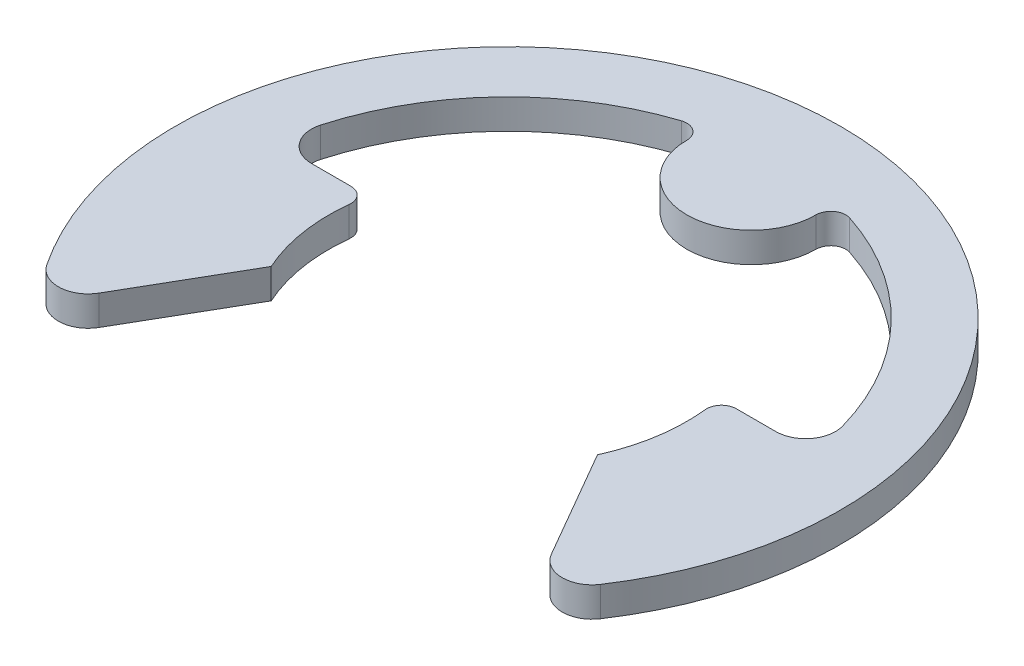
ISO-10303-21;
HEADER;
FILE_DESCRIPTION(('STEP AP214'),'2;1');
FILE_NAME('part.step','',(''),(''),'','','');
FILE_SCHEMA(('AUTOMOTIVE_DESIGN { 1 0 10303 214 1 1 1 1 }'));
ENDSEC;
DATA;
#1=APPLICATION_CONTEXT('core data for automotive mechanical design processes');
#2=APPLICATION_PROTOCOL_DEFINITION('international standard','automotive_design',2000,#1);
#3=PRODUCT_CONTEXT('',#1,'mechanical');
#4=PRODUCT('Part','Part','',(#3));
#5=PRODUCT_RELATED_PRODUCT_CATEGORY('part','',(#4));
#6=PRODUCT_DEFINITION_FORMATION('','',#4);
#7=PRODUCT_DEFINITION_CONTEXT('part definition',#1,'design');
#8=PRODUCT_DEFINITION('design','',#6,#7);
#9=PRODUCT_DEFINITION_SHAPE('','',#8);
#10=(LENGTH_UNIT() NAMED_UNIT(*) SI_UNIT(.MILLI.,.METRE.));
#11=(NAMED_UNIT(*) PLANE_ANGLE_UNIT() SI_UNIT($,.RADIAN.));
#12=(NAMED_UNIT(*) SI_UNIT($,.STERADIAN.) SOLID_ANGLE_UNIT());
#13=UNCERTAINTY_MEASURE_WITH_UNIT(LENGTH_MEASURE(1.E-05),#10,'distance_accuracy_value','');
#14=(GEOMETRIC_REPRESENTATION_CONTEXT(3) GLOBAL_UNCERTAINTY_ASSIGNED_CONTEXT((#13)) GLOBAL_UNIT_ASSIGNED_CONTEXT((#10,
#11,#12)) REPRESENTATION_CONTEXT('',''));
#15=CARTESIAN_POINT('',(0.,0.,0.));
#16=DIRECTION('',(0.,0.,1.));
#17=DIRECTION('',(1.,0.,0.));
#18=AXIS2_PLACEMENT_3D('',#15,#16,#17);
#19=CARTESIAN_POINT('',(0.,2.,0.));
#20=DIRECTION('',(0.,-1.,0.));
#21=DIRECTION('',(0.,0.,-1.));
#22=AXIS2_PLACEMENT_3D('',#19,#20,#21);
#23=CYLINDRICAL_SURFACE('',#22,12.);
#24=CARTESIAN_POINT('',(0.,0.,0.));
#25=DIRECTION('',(0.,-1.,0.));
#26=DIRECTION('',(0.,0.,1.));
#27=AXIS2_PLACEMENT_3D('',#24,#25,#26);
#28=CIRCLE('',#27,12.);
#29=CARTESIAN_POINT('',(11.9302112650364,0.,-1.29230769230769));
#30=VERTEX_POINT('',#29);
#31=CARTESIAN_POINT('',(10.94,0.,4.9311661906693));
#32=VERTEX_POINT('',#31);
#33=EDGE_CURVE('E200',#30,#32,#28,.T.);
#34=ORIENTED_EDGE('',*,*,#33,.T.);
#35=DIRECTION('',(0.,-1.,0.));
#36=VECTOR('',#35,1.);
#37=CARTESIAN_POINT('',(10.94,2.,4.9311661906693));
#38=LINE('',#37,#36);
#39=CARTESIAN_POINT('',(10.94,2.,4.9311661906693));
#40=VERTEX_POINT('',#39);
#41=EDGE_CURVE('E11',#40,#32,#38,.T.);
#42=ORIENTED_EDGE('',*,*,#41,.F.);
#43=CARTESIAN_POINT('',(0.,2.,0.));
#44=DIRECTION('',(0.,-1.,0.));
#45=DIRECTION('',(0.,0.,1.));
#46=AXIS2_PLACEMENT_3D('',#43,#44,#45);
#47=CIRCLE('',#46,12.);
#48=CARTESIAN_POINT('',(11.9302112650364,2.,-1.29230769230769));
#49=VERTEX_POINT('',#48);
#50=EDGE_CURVE('E252',#49,#40,#47,.T.);
#51=ORIENTED_EDGE('',*,*,#50,.F.);
#52=DIRECTION('',(0.,-1.,0.));
#53=VECTOR('',#52,1.);
#54=CARTESIAN_POINT('',(11.9302112650364,2.,-1.29230769230769));
#55=LINE('',#54,#53);
#56=EDGE_CURVE('E196',#49,#30,#55,.T.);
#57=ORIENTED_EDGE('',*,*,#56,.T.);
#58=EDGE_LOOP('',(#34,#42,#51,#57));
#59=FACE_BOUND('',#58,.T.);
#60=ADVANCED_FACE('F39',(#59),#23,.F.);
#61=CARTESIAN_POINT('',(15.1655202284553,2.,12.249981914764));
#62=DIRECTION('',(0.866025403784439,0.,-0.499999999999999));
#63=DIRECTION('',(-0.499999999999999,0.,-0.866025403784439));
#64=AXIS2_PLACEMENT_3D('',#61,#62,#63);
#65=PLANE('',#64);
#66=DIRECTION('',(0.499999999999999,0.,0.866025403784439));
#67=VECTOR('',#66,1.);
#68=CARTESIAN_POINT('',(15.1655202284553,0.,12.249981914764));
#69=LINE('',#68,#67);
#70=CARTESIAN_POINT('',(15.1655202284553,0.,12.249981914764));
#71=VERTEX_POINT('',#70);
#72=EDGE_CURVE('E204',#32,#71,#69,.T.);
#73=ORIENTED_EDGE('',*,*,#72,.T.);
#74=DIRECTION('',(0.,-1.,0.));
#75=VECTOR('',#74,1.);
#76=CARTESIAN_POINT('',(15.1655202284553,2.,12.249981914764));
#77=LINE('',#76,#75);
#78=CARTESIAN_POINT('',(15.1655202284553,2.,12.249981914764));
#79=VERTEX_POINT('',#78);
#80=EDGE_CURVE('E48',#79,#71,#77,.T.);
#81=ORIENTED_EDGE('',*,*,#80,.F.);
#82=DIRECTION('',(0.499999999999999,0.,0.866025403784439));
#83=VECTOR('',#82,1.);
#84=CARTESIAN_POINT('',(15.1655202284553,2.,12.249981914764));
#85=LINE('',#84,#83);
#86=EDGE_CURVE('E129',#40,#79,#85,.T.);
#87=ORIENTED_EDGE('',*,*,#86,.F.);
#88=ORIENTED_EDGE('',*,*,#41,.T.);
#89=EDGE_LOOP('',(#73,#81,#87,#88));
#90=FACE_BOUND('',#89,.T.);
#91=ADVANCED_FACE('F388',(#90),#65,.F.);
#92=CARTESIAN_POINT('',(16.8975710360242,2.,11.249981914764));
#93=DIRECTION('',(0.,-1.,0.));
#94=DIRECTION('',(0.,0.,-1.));
#95=AXIS2_PLACEMENT_3D('',#92,#93,#94);
#96=CYLINDRICAL_SURFACE('',#95,2.);
#97=CARTESIAN_POINT('',(16.8975710360242,0.,11.249981914764));
#98=DIRECTION('',(0.,1.,0.));
#99=DIRECTION('',(0.,0.,-1.));
#100=AXIS2_PLACEMENT_3D('',#97,#98,#99);
#101=CIRCLE('',#100,2.);
#102=CARTESIAN_POINT('',(18.5623563597704,0.,12.3583545172038));
#103=VERTEX_POINT('',#102);
#104=EDGE_CURVE('E207',#71,#103,#101,.T.);
#105=ORIENTED_EDGE('',*,*,#104,.T.);
#106=DIRECTION('',(0.,-1.,0.));
#107=VECTOR('',#106,1.);
#108=CARTESIAN_POINT('',(18.5623563597704,2.,12.3583545172038));
#109=LINE('',#108,#107);
#110=CARTESIAN_POINT('',(18.5623563597704,2.,12.3583545172038));
#111=VERTEX_POINT('',#110);
#112=EDGE_CURVE('E303',#111,#103,#109,.T.);
#113=ORIENTED_EDGE('',*,*,#112,.F.);
#114=CARTESIAN_POINT('',(16.8975710360242,2.,11.249981914764));
#115=DIRECTION('',(0.,1.,0.));
#116=DIRECTION('',(0.,0.,-1.));
#117=AXIS2_PLACEMENT_3D('',#114,#115,#116);
#118=CIRCLE('',#117,2.);
#119=EDGE_CURVE('E313',#79,#111,#118,.T.);
#120=ORIENTED_EDGE('',*,*,#119,.F.);
#121=ORIENTED_EDGE('',*,*,#80,.T.);
#122=EDGE_LOOP('',(#105,#113,#120,#121));
#123=FACE_BOUND('',#122,.T.);
#124=ADVANCED_FACE('F311',(#123),#96,.T.);
#125=CARTESIAN_POINT('',(0.,2.,0.));
#126=DIRECTION('',(0.,-1.,0.));
#127=DIRECTION('',(0.,0.,-1.));
#128=AXIS2_PLACEMENT_3D('',#125,#126,#127);
#129=CYLINDRICAL_SURFACE('',#128,22.3);
#130=CARTESIAN_POINT('',(0.,0.,0.));
#131=DIRECTION('',(0.,1.,0.));
#132=DIRECTION('',(0.,0.,-1.));
#133=AXIS2_PLACEMENT_3D('',#130,#131,#132);
#134=CIRCLE('',#133,22.3);
#135=CARTESIAN_POINT('',(-18.5623563597704,0.,12.3583545172038));
#136=VERTEX_POINT('',#135);
#137=EDGE_CURVE('E210',#103,#136,#134,.T.);
#138=ORIENTED_EDGE('',*,*,#137,.T.);
#139=DIRECTION('',(0.,-1.,0.));
#140=VECTOR('',#139,1.);
#141=CARTESIAN_POINT('',(-18.5623563597704,2.,12.3583545172038));
#142=LINE('',#141,#140);
#143=CARTESIAN_POINT('',(-18.5623563597704,2.,12.3583545172038));
#144=VERTEX_POINT('',#143);
#145=EDGE_CURVE('E299',#144,#136,#142,.T.);
#146=ORIENTED_EDGE('',*,*,#145,.F.);
#147=CARTESIAN_POINT('',(0.,2.,0.));
#148=DIRECTION('',(0.,1.,0.));
#149=DIRECTION('',(0.,0.,-1.));
#150=AXIS2_PLACEMENT_3D('',#147,#148,#149);
#151=CIRCLE('',#150,22.3);
#152=EDGE_CURVE('E332',#111,#144,#151,.T.);
#153=ORIENTED_EDGE('',*,*,#152,.F.);
#154=ORIENTED_EDGE('',*,*,#112,.T.);
#155=EDGE_LOOP('',(#138,#146,#153,#154));
#156=FACE_BOUND('',#155,.T.);
#157=ADVANCED_FACE('F322',(#156),#129,.T.);
#158=CARTESIAN_POINT('',(-16.8975710360242,2.,11.249981914764));
#159=DIRECTION('',(0.,-1.,0.));
#160=DIRECTION('',(0.,0.,-1.));
#161=AXIS2_PLACEMENT_3D('',#158,#159,#160);
#162=CYLINDRICAL_SURFACE('',#161,2.);
#163=CARTESIAN_POINT('',(-16.8975710360242,0.,11.249981914764));
#164=DIRECTION('',(0.,1.,0.));
#165=DIRECTION('',(0.,0.,-1.));
#166=AXIS2_PLACEMENT_3D('',#163,#164,#165);
#167=CIRCLE('',#166,2.);
#168=CARTESIAN_POINT('',(-15.1655202284553,0.,12.249981914764));
#169=VERTEX_POINT('',#168);
#170=EDGE_CURVE('E213',#136,#169,#167,.T.);
#171=ORIENTED_EDGE('',*,*,#170,.T.);
#172=DIRECTION('',(0.,-1.,0.));
#173=VECTOR('',#172,1.);
#174=CARTESIAN_POINT('',(-15.1655202284553,2.,12.249981914764));
#175=LINE('',#174,#173);
#176=CARTESIAN_POINT('',(-15.1655202284553,2.,12.249981914764));
#177=VERTEX_POINT('',#176);
#178=EDGE_CURVE('E295',#177,#169,#175,.T.);
#179=ORIENTED_EDGE('',*,*,#178,.F.);
#180=CARTESIAN_POINT('',(-16.8975710360242,2.,11.249981914764));
#181=DIRECTION('',(0.,1.,0.));
#182=DIRECTION('',(0.,0.,-1.));
#183=AXIS2_PLACEMENT_3D('',#180,#181,#182);
#184=CIRCLE('',#183,2.);
#185=EDGE_CURVE('E328',#144,#177,#184,.T.);
#186=ORIENTED_EDGE('',*,*,#185,.F.);
#187=ORIENTED_EDGE('',*,*,#145,.T.);
#188=EDGE_LOOP('',(#171,#179,#186,#187));
#189=FACE_BOUND('',#188,.T.);
#190=ADVANCED_FACE('F326',(#189),#162,.T.);
#191=CARTESIAN_POINT('',(-10.94,2.,4.9311661906693));
#192=DIRECTION('',(-0.86602540378444,0.,-0.499999999999997));
#193=DIRECTION('',(-0.499999999999997,0.,0.86602540378444));
#194=AXIS2_PLACEMENT_3D('',#191,#192,#193);
#195=PLANE('',#194);
#196=DIRECTION('',(0.499999999999997,0.,-0.86602540378444));
#197=VECTOR('',#196,1.);
#198=CARTESIAN_POINT('',(-10.94,0.,4.9311661906693));
#199=LINE('',#198,#197);
#200=CARTESIAN_POINT('',(-10.94,0.,4.9311661906693));
#201=VERTEX_POINT('',#200);
#202=EDGE_CURVE('E216',#169,#201,#199,.T.);
#203=ORIENTED_EDGE('',*,*,#202,.T.);
#204=DIRECTION('',(0.,-1.,0.));
#205=VECTOR('',#204,1.);
#206=CARTESIAN_POINT('',(-10.94,2.,4.9311661906693));
#207=LINE('',#206,#205);
#208=CARTESIAN_POINT('',(-10.94,2.,4.9311661906693));
#209=VERTEX_POINT('',#208);
#210=EDGE_CURVE('E291',#209,#201,#207,.T.);
#211=ORIENTED_EDGE('',*,*,#210,.F.);
#212=DIRECTION('',(0.499999999999997,0.,-0.86602540378444));
#213=VECTOR('',#212,1.);
#214=CARTESIAN_POINT('',(-10.94,2.,4.9311661906693));
#215=LINE('',#214,#213);
#216=EDGE_CURVE('E331',#177,#209,#215,.T.);
#217=ORIENTED_EDGE('',*,*,#216,.F.);
#218=ORIENTED_EDGE('',*,*,#178,.T.);
#219=EDGE_LOOP('',(#203,#211,#217,#218));
#220=FACE_BOUND('',#219,.T.);
#221=ADVANCED_FACE('F401',(#220),#195,.F.);
#222=CARTESIAN_POINT('',(0.,2.,0.));
#223=DIRECTION('',(0.,-1.,0.));
#224=DIRECTION('',(0.,0.,-1.));
#225=AXIS2_PLACEMENT_3D('',#222,#223,#224);
#226=CYLINDRICAL_SURFACE('',#225,12.);
#227=CARTESIAN_POINT('',(0.,0.,0.));
#228=DIRECTION('',(0.,-1.,0.));
#229=DIRECTION('',(0.,0.,1.));
#230=AXIS2_PLACEMENT_3D('',#227,#228,#229);
#231=CIRCLE('',#230,12.);
#232=CARTESIAN_POINT('',(-11.9302112650364,0.,-1.29230769230769));
#233=VERTEX_POINT('',#232);
#234=EDGE_CURVE('E219',#201,#233,#231,.T.);
#235=ORIENTED_EDGE('',*,*,#234,.T.);
#236=DIRECTION('',(0.,-1.,0.));
#237=VECTOR('',#236,1.);
#238=CARTESIAN_POINT('',(-11.9302112650364,2.,-1.29230769230769));
#239=LINE('',#238,#237);
#240=CARTESIAN_POINT('',(-11.9302112650364,2.,-1.29230769230769));
#241=VERTEX_POINT('',#240);
#242=EDGE_CURVE('E287',#241,#233,#239,.T.);
#243=ORIENTED_EDGE('',*,*,#242,.F.);
#244=CARTESIAN_POINT('',(0.,2.,0.));
#245=DIRECTION('',(0.,-1.,0.));
#246=DIRECTION('',(0.,0.,1.));
#247=AXIS2_PLACEMENT_3D('',#244,#245,#246);
#248=CIRCLE('',#247,12.);
#249=EDGE_CURVE('E336',#209,#241,#248,.T.);
#250=ORIENTED_EDGE('',*,*,#249,.F.);
#251=ORIENTED_EDGE('',*,*,#210,.T.);
#252=EDGE_LOOP('',(#235,#243,#250,#251));
#253=FACE_BOUND('',#252,.T.);
#254=ADVANCED_FACE('F404',(#253),#226,.F.);
#255=CARTESIAN_POINT('',(-12.9243955371228,2.,-1.4));
#256=DIRECTION('',(0.,-1.,0.));
#257=DIRECTION('',(0.,0.,-1.));
#258=AXIS2_PLACEMENT_3D('',#255,#256,#257);
#259=CYLINDRICAL_SURFACE('',#258,1.);
#260=CARTESIAN_POINT('',(-12.9243955371228,0.,-1.4));
#261=DIRECTION('',(0.,1.,0.));
#262=DIRECTION('',(0.,0.,-1.));
#263=AXIS2_PLACEMENT_3D('',#260,#261,#262);
#264=CIRCLE('',#263,1.);
#265=CARTESIAN_POINT('',(-12.9243955371228,0.,-2.4));
#266=VERTEX_POINT('',#265);
#267=EDGE_CURVE('E222',#233,#266,#264,.T.);
#268=ORIENTED_EDGE('',*,*,#267,.T.);
#269=DIRECTION('',(0.,-1.,0.));
#270=VECTOR('',#269,1.);
#271=CARTESIAN_POINT('',(-12.9243955371228,2.,-2.4));
#272=LINE('',#271,#270);
#273=CARTESIAN_POINT('',(-12.9243955371228,2.,-2.4));
#274=VERTEX_POINT('',#273);
#275=EDGE_CURVE('E283',#274,#266,#272,.T.);
#276=ORIENTED_EDGE('',*,*,#275,.F.);
#277=CARTESIAN_POINT('',(-12.9243955371228,2.,-1.4));
#278=DIRECTION('',(0.,1.,0.));
#279=DIRECTION('',(0.,0.,-1.));
#280=AXIS2_PLACEMENT_3D('',#277,#278,#279);
#281=CIRCLE('',#280,1.);
#282=EDGE_CURVE('E343',#241,#274,#281,.T.);
#283=ORIENTED_EDGE('',*,*,#282,.F.);
#284=ORIENTED_EDGE('',*,*,#242,.T.);
#285=EDGE_LOOP('',(#268,#276,#283,#284));
#286=FACE_BOUND('',#285,.T.);
#287=ADVANCED_FACE('F408',(#286),#259,.T.);
#288=CARTESIAN_POINT('',(-15.5702408459214,2.,-2.4));
#289=DIRECTION('',(0.,0.,1.));
#290=DIRECTION('',(1.,0.,0.));
#291=AXIS2_PLACEMENT_3D('',#288,#289,#290);
#292=PLANE('',#291);
#293=DIRECTION('',(-1.,0.,0.));
#294=VECTOR('',#293,1.);
#295=CARTESIAN_POINT('',(-15.5702408459214,0.,-2.4));
#296=LINE('',#295,#294);
#297=CARTESIAN_POINT('',(-15.5702408459214,0.,-2.4));
#298=VERTEX_POINT('',#297);
#299=EDGE_CURVE('E225',#266,#298,#296,.T.);
#300=ORIENTED_EDGE('',*,*,#299,.T.);
#301=DIRECTION('',(0.,-1.,0.));
#302=VECTOR('',#301,1.);
#303=CARTESIAN_POINT('',(-15.5702408459214,2.,-2.4));
#304=LINE('',#303,#302);
#305=CARTESIAN_POINT('',(-15.5702408459214,2.,-2.4));
#306=VERTEX_POINT('',#305);
#307=EDGE_CURVE('E279',#306,#298,#304,.T.);
#308=ORIENTED_EDGE('',*,*,#307,.F.);
#309=DIRECTION('',(-1.,0.,0.));
#310=VECTOR('',#309,1.);
#311=CARTESIAN_POINT('',(-15.5702408459214,2.,-2.4));
#312=LINE('',#311,#310);
#313=EDGE_CURVE('E346',#274,#306,#312,.T.);
#314=ORIENTED_EDGE('',*,*,#313,.F.);
#315=ORIENTED_EDGE('',*,*,#275,.T.);
#316=EDGE_LOOP('',(#300,#308,#314,#315));
#317=FACE_BOUND('',#316,.T.);
#318=ADVANCED_FACE('F412',(#317),#292,.F.);
#319=CARTESIAN_POINT('',(-15.5702408459214,2.,-4.4));
#320=DIRECTION('',(0.,-1.,0.));
#321=DIRECTION('',(0.,0.,-1.));
#322=AXIS2_PLACEMENT_3D('',#319,#320,#321);
#323=CYLINDRICAL_SURFACE('',#322,2.);
#324=CARTESIAN_POINT('',(-15.5702408459214,0.,-4.4));
#325=DIRECTION('',(0.,-1.,0.));
#326=DIRECTION('',(0.,0.,1.));
#327=AXIS2_PLACEMENT_3D('',#324,#325,#326);
#328=CIRCLE('',#327,2.);
#329=CARTESIAN_POINT('',(-17.4948688862084,0.,-4.94388133498146));
#330=VERTEX_POINT('',#329);
#331=EDGE_CURVE('E228',#298,#330,#328,.T.);
#332=ORIENTED_EDGE('',*,*,#331,.T.);
#333=DIRECTION('',(0.,-1.,0.));
#334=VECTOR('',#333,1.);
#335=CARTESIAN_POINT('',(-17.4948688862084,2.,-4.94388133498146));
#336=LINE('',#335,#334);
#337=CARTESIAN_POINT('',(-17.4948688862084,2.,-4.94388133498146));
#338=VERTEX_POINT('',#337);
#339=EDGE_CURVE('E275',#338,#330,#336,.T.);
#340=ORIENTED_EDGE('',*,*,#339,.F.);
#341=CARTESIAN_POINT('',(-15.5702408459214,2.,-4.4));
#342=DIRECTION('',(0.,-1.,0.));
#343=DIRECTION('',(0.,0.,1.));
#344=AXIS2_PLACEMENT_3D('',#341,#342,#343);
#345=CIRCLE('',#344,2.);
#346=EDGE_CURVE('E349',#306,#338,#345,.T.);
#347=ORIENTED_EDGE('',*,*,#346,.F.);
#348=ORIENTED_EDGE('',*,*,#307,.T.);
#349=EDGE_LOOP('',(#332,#340,#347,#348));
#350=FACE_BOUND('',#349,.T.);
#351=ADVANCED_FACE('F416',(#350),#323,.F.);
#352=CARTESIAN_POINT('',(0.,2.,0.));
#353=DIRECTION('',(0.,-1.,0.));
#354=DIRECTION('',(0.,0.,-1.));
#355=AXIS2_PLACEMENT_3D('',#352,#353,#354);
#356=CYLINDRICAL_SURFACE('',#355,18.18);
#357=CARTESIAN_POINT('',(0.,0.,0.));
#358=DIRECTION('',(0.,-1.,0.));
#359=DIRECTION('',(0.,0.,1.));
#360=AXIS2_PLACEMENT_3D('',#357,#358,#359);
#361=CIRCLE('',#360,18.18);
#362=CARTESIAN_POINT('',(-5.64206663059063,0.,-17.2823460252356));
#363=VERTEX_POINT('',#362);
#364=EDGE_CURVE('E231',#330,#363,#361,.T.);
#365=ORIENTED_EDGE('',*,*,#364,.T.);
#366=DIRECTION('',(0.,-1.,0.));
#367=VECTOR('',#366,1.);
#368=CARTESIAN_POINT('',(-5.64206663059063,2.,-17.2823460252356));
#369=LINE('',#368,#367);
#370=CARTESIAN_POINT('',(-5.64206663059063,2.,-17.2823460252356));
#371=VERTEX_POINT('',#370);
#372=EDGE_CURVE('E271',#371,#363,#369,.T.);
#373=ORIENTED_EDGE('',*,*,#372,.F.);
#374=CARTESIAN_POINT('',(0.,2.,0.));
#375=DIRECTION('',(0.,-1.,0.));
#376=DIRECTION('',(0.,0.,1.));
#377=AXIS2_PLACEMENT_3D('',#374,#375,#376);
#378=CIRCLE('',#377,18.18);
#379=EDGE_CURVE('E352',#338,#371,#378,.T.);
#380=ORIENTED_EDGE('',*,*,#379,.F.);
#381=ORIENTED_EDGE('',*,*,#339,.T.);
#382=EDGE_LOOP('',(#365,#373,#380,#381));
#383=FACE_BOUND('',#382,.T.);
#384=ADVANCED_FACE('F420',(#383),#356,.F.);
#385=CARTESIAN_POINT('',(-5.33172193143823,2.,-16.3317219314382));
#386=DIRECTION('',(0.,-1.,0.));
#387=DIRECTION('',(0.,0.,-1.));
#388=AXIS2_PLACEMENT_3D('',#385,#386,#387);
#389=CYLINDRICAL_SURFACE('',#388,1.);
#390=CARTESIAN_POINT('',(-5.33172193143823,0.,-16.3317219314382));
#391=DIRECTION('',(0.,-1.,0.));
#392=DIRECTION('',(0.,0.,1.));
#393=AXIS2_PLACEMENT_3D('',#390,#391,#392);
#394=CIRCLE('',#393,1.);
#395=CARTESIAN_POINT('',(-4.33172193143823,0.,-16.3317219314382));
#396=VERTEX_POINT('',#395);
#397=EDGE_CURVE('E234',#363,#396,#394,.T.);
#398=ORIENTED_EDGE('',*,*,#397,.T.);
#399=DIRECTION('',(0.,-1.,0.));
#400=VECTOR('',#399,1.);
#401=CARTESIAN_POINT('',(-4.33172193143823,2.,-16.3317219314382));
#402=LINE('',#401,#400);
#403=CARTESIAN_POINT('',(-4.33172193143823,2.,-16.3317219314382));
#404=VERTEX_POINT('',#403);
#405=EDGE_CURVE('E267',#404,#396,#402,.T.);
#406=ORIENTED_EDGE('',*,*,#405,.F.);
#407=CARTESIAN_POINT('',(-5.33172193143823,2.,-16.3317219314382));
#408=DIRECTION('',(0.,-1.,0.));
#409=DIRECTION('',(0.,0.,1.));
#410=AXIS2_PLACEMENT_3D('',#407,#408,#409);
#411=CIRCLE('',#410,1.);
#412=EDGE_CURVE('E355',#371,#404,#411,.T.);
#413=ORIENTED_EDGE('',*,*,#412,.F.);
#414=ORIENTED_EDGE('',*,*,#372,.T.);
#415=EDGE_LOOP('',(#398,#406,#413,#414));
#416=FACE_BOUND('',#415,.T.);
#417=ADVANCED_FACE('F424',(#416),#389,.F.);
#418=CARTESIAN_POINT('',(0.,2.,-16.3317219314382));
#419=DIRECTION('',(0.,-1.,0.));
#420=DIRECTION('',(0.,0.,-1.));
#421=AXIS2_PLACEMENT_3D('',#418,#419,#420);
#422=CYLINDRICAL_SURFACE('',#421,4.33172193143823);
#423=CARTESIAN_POINT('',(0.,0.,-16.3317219314382));
#424=DIRECTION('',(0.,1.,0.));
#425=DIRECTION('',(0.,0.,-1.));
#426=AXIS2_PLACEMENT_3D('',#423,#424,#425);
#427=CIRCLE('',#426,4.33172193143823);
#428=CARTESIAN_POINT('',(4.33172193143823,0.,-16.3317219314382));
#429=VERTEX_POINT('',#428);
#430=EDGE_CURVE('E237',#396,#429,#427,.T.);
#431=ORIENTED_EDGE('',*,*,#430,.T.);
#432=DIRECTION('',(0.,-1.,0.));
#433=VECTOR('',#432,1.);
#434=CARTESIAN_POINT('',(4.33172193143823,2.,-16.3317219314382));
#435=LINE('',#434,#433);
#436=CARTESIAN_POINT('',(4.33172193143823,2.,-16.3317219314382));
#437=VERTEX_POINT('',#436);
#438=EDGE_CURVE('E263',#437,#429,#435,.T.);
#439=ORIENTED_EDGE('',*,*,#438,.F.);
#440=CARTESIAN_POINT('',(0.,2.,-16.3317219314382));
#441=DIRECTION('',(0.,1.,0.));
#442=DIRECTION('',(0.,0.,-1.));
#443=AXIS2_PLACEMENT_3D('',#440,#441,#442);
#444=CIRCLE('',#443,4.33172193143823);
#445=EDGE_CURVE('E358',#404,#437,#444,.T.);
#446=ORIENTED_EDGE('',*,*,#445,.F.);
#447=ORIENTED_EDGE('',*,*,#405,.T.);
#448=EDGE_LOOP('',(#431,#439,#446,#447));
#449=FACE_BOUND('',#448,.T.);
#450=ADVANCED_FACE('F428',(#449),#422,.T.);
#451=CARTESIAN_POINT('',(5.33172193143823,2.,-16.3317219314382));
#452=DIRECTION('',(0.,-1.,0.));
#453=DIRECTION('',(0.,0.,-1.));
#454=AXIS2_PLACEMENT_3D('',#451,#452,#453);
#455=CYLINDRICAL_SURFACE('',#454,1.);
#456=CARTESIAN_POINT('',(5.33172193143823,0.,-16.3317219314382));
#457=DIRECTION('',(0.,-1.,0.));
#458=DIRECTION('',(0.,0.,1.));
#459=AXIS2_PLACEMENT_3D('',#456,#457,#458);
#460=CIRCLE('',#459,1.);
#461=CARTESIAN_POINT('',(5.64206663059063,0.,-17.2823460252356));
#462=VERTEX_POINT('',#461);
#463=EDGE_CURVE('E240',#429,#462,#460,.T.);
#464=ORIENTED_EDGE('',*,*,#463,.T.);
#465=DIRECTION('',(0.,-1.,0.));
#466=VECTOR('',#465,1.);
#467=CARTESIAN_POINT('',(5.64206663059063,2.,-17.2823460252356));
#468=LINE('',#467,#466);
#469=CARTESIAN_POINT('',(5.64206663059063,2.,-17.2823460252356));
#470=VERTEX_POINT('',#469);
#471=EDGE_CURVE('E259',#470,#462,#468,.T.);
#472=ORIENTED_EDGE('',*,*,#471,.F.);
#473=CARTESIAN_POINT('',(5.33172193143823,2.,-16.3317219314382));
#474=DIRECTION('',(0.,-1.,0.));
#475=DIRECTION('',(0.,0.,1.));
#476=AXIS2_PLACEMENT_3D('',#473,#474,#475);
#477=CIRCLE('',#476,1.);
#478=EDGE_CURVE('E361',#437,#470,#477,.T.);
#479=ORIENTED_EDGE('',*,*,#478,.F.);
#480=ORIENTED_EDGE('',*,*,#438,.T.);
#481=EDGE_LOOP('',(#464,#472,#479,#480));
#482=FACE_BOUND('',#481,.T.);
#483=ADVANCED_FACE('F369',(#482),#455,.F.);
#484=CARTESIAN_POINT('',(0.,2.,0.));
#485=DIRECTION('',(0.,-1.,0.));
#486=DIRECTION('',(0.,0.,-1.));
#487=AXIS2_PLACEMENT_3D('',#484,#485,#486);
#488=CYLINDRICAL_SURFACE('',#487,18.18);
#489=CARTESIAN_POINT('',(0.,0.,0.));
#490=DIRECTION('',(0.,-1.,0.));
#491=DIRECTION('',(0.,0.,1.));
#492=AXIS2_PLACEMENT_3D('',#489,#490,#491);
#493=CIRCLE('',#492,18.18);
#494=CARTESIAN_POINT('',(17.4948688862084,0.,-4.94388133498146));
#495=VERTEX_POINT('',#494);
#496=EDGE_CURVE('E243',#462,#495,#493,.T.);
#497=ORIENTED_EDGE('',*,*,#496,.T.);
#498=DIRECTION('',(0.,-1.,0.));
#499=VECTOR('',#498,1.);
#500=CARTESIAN_POINT('',(17.4948688862084,2.,-4.94388133498146));
#501=LINE('',#500,#499);
#502=CARTESIAN_POINT('',(17.4948688862084,2.,-4.94388133498146));
#503=VERTEX_POINT('',#502);
#504=EDGE_CURVE('E189',#503,#495,#501,.T.);
#505=ORIENTED_EDGE('',*,*,#504,.F.);
#506=CARTESIAN_POINT('',(0.,2.,0.));
#507=DIRECTION('',(0.,-1.,0.));
#508=DIRECTION('',(0.,0.,1.));
#509=AXIS2_PLACEMENT_3D('',#506,#507,#508);
#510=CIRCLE('',#509,18.18);
#511=EDGE_CURVE('E178',#470,#503,#510,.T.);
#512=ORIENTED_EDGE('',*,*,#511,.F.);
#513=ORIENTED_EDGE('',*,*,#471,.T.);
#514=EDGE_LOOP('',(#497,#505,#512,#513));
#515=FACE_BOUND('',#514,.T.);
#516=ADVANCED_FACE('F373',(#515),#488,.F.);
#517=CARTESIAN_POINT('',(15.5702408459214,2.,-4.4));
#518=DIRECTION('',(0.,-1.,0.));
#519=DIRECTION('',(0.,0.,-1.));
#520=AXIS2_PLACEMENT_3D('',#517,#518,#519);
#521=CYLINDRICAL_SURFACE('',#520,2.);
#522=CARTESIAN_POINT('',(15.5702408459214,0.,-4.4));
#523=DIRECTION('',(0.,-1.,0.));
#524=DIRECTION('',(0.,0.,1.));
#525=AXIS2_PLACEMENT_3D('',#522,#523,#524);
#526=CIRCLE('',#525,2.);
#527=CARTESIAN_POINT('',(15.5702408459214,0.,-2.4));
#528=VERTEX_POINT('',#527);
#529=EDGE_CURVE('E187',#495,#528,#526,.T.);
#530=ORIENTED_EDGE('',*,*,#529,.T.);
#531=DIRECTION('',(0.,-1.,0.));
#532=VECTOR('',#531,1.);
#533=CARTESIAN_POINT('',(15.5702408459214,2.,-2.4));
#534=LINE('',#533,#532);
#535=CARTESIAN_POINT('',(15.5702408459214,2.,-2.4));
#536=VERTEX_POINT('',#535);
#537=EDGE_CURVE('E184',#536,#528,#534,.T.);
#538=ORIENTED_EDGE('',*,*,#537,.F.);
#539=CARTESIAN_POINT('',(15.5702408459214,2.,-4.4));
#540=DIRECTION('',(0.,-1.,0.));
#541=DIRECTION('',(0.,0.,1.));
#542=AXIS2_PLACEMENT_3D('',#539,#540,#541);
#543=CIRCLE('',#542,2.);
#544=EDGE_CURVE('E172',#503,#536,#543,.T.);
#545=ORIENTED_EDGE('',*,*,#544,.F.);
#546=ORIENTED_EDGE('',*,*,#504,.T.);
#547=EDGE_LOOP('',(#530,#538,#545,#546));
#548=FACE_BOUND('',#547,.T.);
#549=ADVANCED_FACE('F185',(#548),#521,.F.);
#550=CARTESIAN_POINT('',(12.9243955371228,2.,-2.4));
#551=DIRECTION('',(0.,0.,1.));
#552=DIRECTION('',(1.,0.,0.));
#553=AXIS2_PLACEMENT_3D('',#550,#551,#552);
#554=PLANE('',#553);
#555=DIRECTION('',(-1.,0.,0.));
#556=VECTOR('',#555,1.);
#557=CARTESIAN_POINT('',(12.9243955371228,0.,-2.4));
#558=LINE('',#557,#556);
#559=CARTESIAN_POINT('',(12.9243955371228,0.,-2.4));
#560=VERTEX_POINT('',#559);
#561=EDGE_CURVE('E115',#528,#560,#558,.T.);
#562=ORIENTED_EDGE('',*,*,#561,.T.);
#563=DIRECTION('',(0.,-1.,0.));
#564=VECTOR('',#563,1.);
#565=CARTESIAN_POINT('',(12.9243955371228,2.,-2.4));
#566=LINE('',#565,#564);
#567=CARTESIAN_POINT('',(12.9243955371228,2.,-2.4));
#568=VERTEX_POINT('',#567);
#569=EDGE_CURVE('E190',#568,#560,#566,.T.);
#570=ORIENTED_EDGE('',*,*,#569,.F.);
#571=DIRECTION('',(-1.,0.,0.));
#572=VECTOR('',#571,1.);
#573=CARTESIAN_POINT('',(12.9243955371228,2.,-2.4));
#574=LINE('',#573,#572);
#575=EDGE_CURVE('E176',#536,#568,#574,.T.);
#576=ORIENTED_EDGE('',*,*,#575,.F.);
#577=ORIENTED_EDGE('',*,*,#537,.T.);
#578=EDGE_LOOP('',(#562,#570,#576,#577));
#579=FACE_BOUND('',#578,.T.);
#580=ADVANCED_FACE('F192',(#579),#554,.F.);
#581=CARTESIAN_POINT('',(12.9243955371228,2.,-1.4));
#582=DIRECTION('',(0.,-1.,0.));
#583=DIRECTION('',(0.,0.,-1.));
#584=AXIS2_PLACEMENT_3D('',#581,#582,#583);
#585=CYLINDRICAL_SURFACE('',#584,1.);
#586=CARTESIAN_POINT('',(12.9243955371228,0.,-1.4));
#587=DIRECTION('',(0.,1.,0.));
#588=DIRECTION('',(0.,0.,-1.));
#589=AXIS2_PLACEMENT_3D('',#586,#587,#588);
#590=CIRCLE('',#589,1.);
#591=EDGE_CURVE('E121',#560,#30,#590,.T.);
#592=ORIENTED_EDGE('',*,*,#591,.T.);
#593=ORIENTED_EDGE('',*,*,#56,.F.);
#594=CARTESIAN_POINT('',(12.9243955371228,2.,-1.4));
#595=DIRECTION('',(0.,1.,0.));
#596=DIRECTION('',(0.,0.,-1.));
#597=AXIS2_PLACEMENT_3D('',#594,#595,#596);
#598=CIRCLE('',#597,1.);
#599=EDGE_CURVE('E56',#568,#49,#598,.T.);
#600=ORIENTED_EDGE('',*,*,#599,.F.);
#601=ORIENTED_EDGE('',*,*,#569,.T.);
#602=EDGE_LOOP('',(#592,#593,#600,#601));
#603=FACE_BOUND('',#602,.T.);
#604=ADVANCED_FACE('F377',(#603),#585,.T.);
#605=CARTESIAN_POINT('',(0.,2.,0.));
#606=DIRECTION('',(0.,1.,0.));
#607=DIRECTION('',(0.,0.,1.));
#608=AXIS2_PLACEMENT_3D('',#605,#606,#607);
#609=PLANE('',#608);
#610=ORIENTED_EDGE('',*,*,#50,.T.);
#611=ORIENTED_EDGE('',*,*,#86,.T.);
#612=ORIENTED_EDGE('',*,*,#119,.T.);
#613=ORIENTED_EDGE('',*,*,#152,.T.);
#614=ORIENTED_EDGE('',*,*,#185,.T.);
#615=ORIENTED_EDGE('',*,*,#216,.T.);
#616=ORIENTED_EDGE('',*,*,#249,.T.);
#617=ORIENTED_EDGE('',*,*,#282,.T.);
#618=ORIENTED_EDGE('',*,*,#313,.T.);
#619=ORIENTED_EDGE('',*,*,#346,.T.);
#620=ORIENTED_EDGE('',*,*,#379,.T.);
#621=ORIENTED_EDGE('',*,*,#412,.T.);
#622=ORIENTED_EDGE('',*,*,#445,.T.);
#623=ORIENTED_EDGE('',*,*,#478,.T.);
#624=ORIENTED_EDGE('',*,*,#511,.T.);
#625=ORIENTED_EDGE('',*,*,#544,.T.);
#626=ORIENTED_EDGE('',*,*,#575,.T.);
#627=ORIENTED_EDGE('',*,*,#599,.T.);
#628=EDGE_LOOP('',(#610,#611,#612,#613,#614,#615,#616,#617,#618,#619,#620,#621,#622,#623,#624,
#625,#626,#627));
#629=FACE_BOUND('',#628,.T.);
#630=ADVANCED_FACE('F174',(#629),#609,.T.);
#631=CARTESIAN_POINT('',(0.,0.,0.));
#632=DIRECTION('',(0.,1.,0.));
#633=DIRECTION('',(0.,0.,1.));
#634=AXIS2_PLACEMENT_3D('',#631,#632,#633);
#635=PLANE('',#634);
#636=ORIENTED_EDGE('',*,*,#33,.F.);
#637=ORIENTED_EDGE('',*,*,#591,.F.);
#638=ORIENTED_EDGE('',*,*,#561,.F.);
#639=ORIENTED_EDGE('',*,*,#529,.F.);
#640=ORIENTED_EDGE('',*,*,#496,.F.);
#641=ORIENTED_EDGE('',*,*,#463,.F.);
#642=ORIENTED_EDGE('',*,*,#430,.F.);
#643=ORIENTED_EDGE('',*,*,#397,.F.);
#644=ORIENTED_EDGE('',*,*,#364,.F.);
#645=ORIENTED_EDGE('',*,*,#331,.F.);
#646=ORIENTED_EDGE('',*,*,#299,.F.);
#647=ORIENTED_EDGE('',*,*,#267,.F.);
#648=ORIENTED_EDGE('',*,*,#234,.F.);
#649=ORIENTED_EDGE('',*,*,#202,.F.);
#650=ORIENTED_EDGE('',*,*,#170,.F.);
#651=ORIENTED_EDGE('',*,*,#137,.F.);
#652=ORIENTED_EDGE('',*,*,#104,.F.);
#653=ORIENTED_EDGE('',*,*,#72,.F.);
#654=EDGE_LOOP('',(#636,#637,#638,#639,#640,#641,#642,#643,#644,#645,#646,#647,#648,#649,#650,
#651,#652,#653));
#655=FACE_BOUND('',#654,.T.);
#656=ADVANCED_FACE('F317',(#655),#635,.F.);
#657=CLOSED_SHELL('',(#60,#91,#124,#157,#190,#221,#254,#287,#318,#351,#384,#417,#450,#483,#516,
#549,#580,#604,#630,#656));
#658=MANIFOLD_SOLID_BREP('B2',#657);
#659=ADVANCED_BREP_SHAPE_REPRESENTATION('',(#18,#658),#14);
#660=SHAPE_DEFINITION_REPRESENTATION(#9,#659);
ENDSEC;
END-ISO-10303-21;
